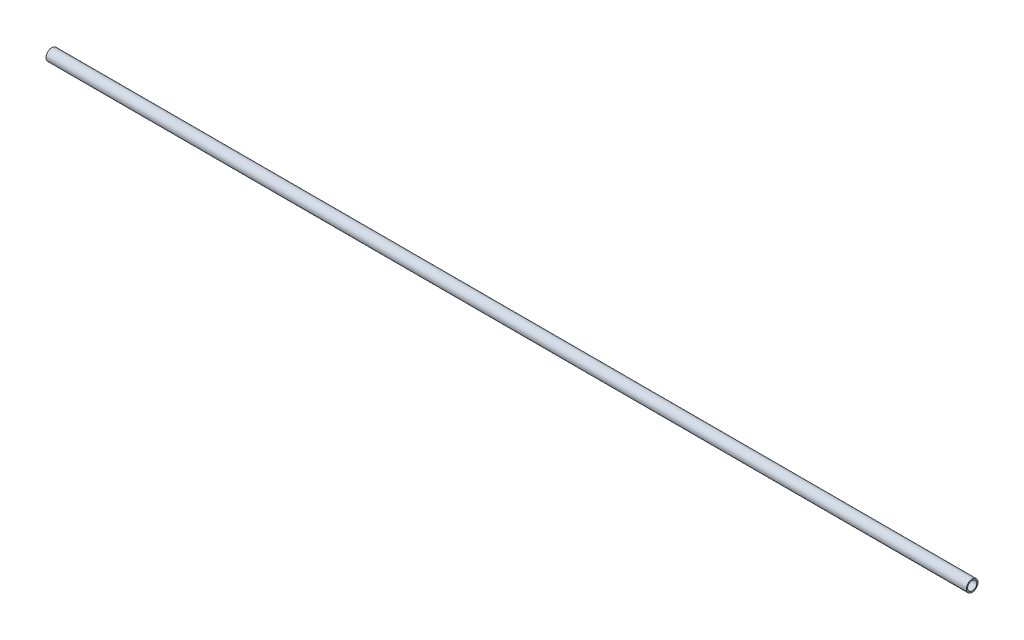
ISO-10303-21;
HEADER;
FILE_DESCRIPTION(('STEP AP214'),'2;1');
FILE_NAME('part.step','',(''),(''),'','','');
FILE_SCHEMA(('AUTOMOTIVE_DESIGN { 1 0 10303 214 1 1 1 1 }'));
ENDSEC;
DATA;
#1=APPLICATION_CONTEXT('core data for automotive mechanical design processes');
#2=APPLICATION_PROTOCOL_DEFINITION('international standard','automotive_design',2000,#1);
#3=PRODUCT_CONTEXT('',#1,'mechanical');
#4=PRODUCT('Part','Part','',(#3));
#5=PRODUCT_RELATED_PRODUCT_CATEGORY('part','',(#4));
#6=PRODUCT_DEFINITION_FORMATION('','',#4);
#7=PRODUCT_DEFINITION_CONTEXT('part definition',#1,'design');
#8=PRODUCT_DEFINITION('design','',#6,#7);
#9=PRODUCT_DEFINITION_SHAPE('','',#8);
#10=(LENGTH_UNIT() NAMED_UNIT(*) SI_UNIT(.MILLI.,.METRE.));
#11=(NAMED_UNIT(*) PLANE_ANGLE_UNIT() SI_UNIT($,.RADIAN.));
#12=(NAMED_UNIT(*) SI_UNIT($,.STERADIAN.) SOLID_ANGLE_UNIT());
#13=UNCERTAINTY_MEASURE_WITH_UNIT(LENGTH_MEASURE(1.E-05),#10,'distance_accuracy_value','');
#14=(GEOMETRIC_REPRESENTATION_CONTEXT(3) GLOBAL_UNCERTAINTY_ASSIGNED_CONTEXT((#13)) GLOBAL_UNIT_ASSIGNED_CONTEXT((#10,
#11,#12)) REPRESENTATION_CONTEXT('',''));
#15=CARTESIAN_POINT('',(0.,0.,0.));
#16=DIRECTION('',(0.,0.,1.));
#17=DIRECTION('',(1.,0.,0.));
#18=AXIS2_PLACEMENT_3D('',#15,#16,#17);
#19=CARTESIAN_POINT('',(3000.,0.,0.));
#20=DIRECTION('',(1.,0.,0.));
#21=DIRECTION('',(0.,0.,-1.));
#22=AXIS2_PLACEMENT_3D('',#19,#20,#21);
#23=PLANE('',#22);
#24=CARTESIAN_POINT('',(3000.,0.,0.));
#25=DIRECTION('',(1.,0.,0.));
#26=DIRECTION('',(0.,0.,-1.));
#27=AXIS2_PLACEMENT_3D('',#24,#25,#26);
#28=CIRCLE('',#27,19.);
#29=CARTESIAN_POINT('',(3000.,0.,-19.));
#30=VERTEX_POINT('',#29);
#31=EDGE_CURVE('E10',#30,#30,#28,.T.);
#32=ORIENTED_EDGE('',*,*,#31,.T.);
#33=EDGE_LOOP('',(#32));
#34=FACE_BOUND('',#33,.T.);
#35=CARTESIAN_POINT('',(3000.,0.,0.));
#36=DIRECTION('',(1.,0.,0.));
#37=DIRECTION('',(0.,0.,-1.));
#38=AXIS2_PLACEMENT_3D('',#35,#36,#37);
#39=CIRCLE('',#38,15.);
#40=CARTESIAN_POINT('',(3000.,0.,-15.));
#41=VERTEX_POINT('',#40);
#42=EDGE_CURVE('E41',#41,#41,#39,.T.);
#43=ORIENTED_EDGE('',*,*,#42,.F.);
#44=EDGE_LOOP('',(#43));
#45=FACE_BOUND('',#44,.T.);
#46=ADVANCED_FACE('F30',(#34,#45),#23,.T.);
#47=CARTESIAN_POINT('',(0.,0.,0.));
#48=DIRECTION('',(1.,0.,0.));
#49=DIRECTION('',(0.,0.,-1.));
#50=AXIS2_PLACEMENT_3D('',#47,#48,#49);
#51=PLANE('',#50);
#52=CARTESIAN_POINT('',(0.,0.,0.));
#53=DIRECTION('',(1.,0.,0.));
#54=DIRECTION('',(0.,0.,-1.));
#55=AXIS2_PLACEMENT_3D('',#52,#53,#54);
#56=CIRCLE('',#55,19.);
#57=CARTESIAN_POINT('',(0.,0.,-19.));
#58=VERTEX_POINT('',#57);
#59=EDGE_CURVE('E34',#58,#58,#56,.T.);
#60=ORIENTED_EDGE('',*,*,#59,.F.);
#61=EDGE_LOOP('',(#60));
#62=FACE_BOUND('',#61,.T.);
#63=CARTESIAN_POINT('',(0.,0.,0.));
#64=DIRECTION('',(1.,0.,0.));
#65=DIRECTION('',(0.,0.,-1.));
#66=AXIS2_PLACEMENT_3D('',#63,#64,#65);
#67=CIRCLE('',#66,15.);
#68=CARTESIAN_POINT('',(0.,0.,-15.));
#69=VERTEX_POINT('',#68);
#70=EDGE_CURVE('E43',#69,#69,#67,.T.);
#71=ORIENTED_EDGE('',*,*,#70,.T.);
#72=EDGE_LOOP('',(#71));
#73=FACE_BOUND('',#72,.T.);
#74=ADVANCED_FACE('F53',(#62,#73),#51,.F.);
#75=CARTESIAN_POINT('',(3000.,0.,0.));
#76=DIRECTION('',(-1.,0.,0.));
#77=DIRECTION('',(0.,0.,1.));
#78=AXIS2_PLACEMENT_3D('',#75,#76,#77);
#79=CYLINDRICAL_SURFACE('',#78,19.);
#80=ORIENTED_EDGE('',*,*,#31,.F.);
#81=EDGE_LOOP('',(#80));
#82=FACE_BOUND('',#81,.T.);
#83=ORIENTED_EDGE('',*,*,#59,.T.);
#84=EDGE_LOOP('',(#83));
#85=FACE_BOUND('',#84,.T.);
#86=ADVANCED_FACE('F32',(#82,#85),#79,.T.);
#87=CARTESIAN_POINT('',(3000.,0.,0.));
#88=DIRECTION('',(-1.,0.,0.));
#89=DIRECTION('',(0.,0.,1.));
#90=AXIS2_PLACEMENT_3D('',#87,#88,#89);
#91=CYLINDRICAL_SURFACE('',#90,15.);
#92=ORIENTED_EDGE('',*,*,#42,.T.);
#93=EDGE_LOOP('',(#92));
#94=FACE_BOUND('',#93,.T.);
#95=ORIENTED_EDGE('',*,*,#70,.F.);
#96=EDGE_LOOP('',(#95));
#97=FACE_BOUND('',#96,.T.);
#98=ADVANCED_FACE('F49',(#94,#97),#91,.F.);
#99=CLOSED_SHELL('',(#46,#74,#86,#98));
#100=MANIFOLD_SOLID_BREP('B2',#99);
#101=ADVANCED_BREP_SHAPE_REPRESENTATION('',(#18,#100),#14);
#102=SHAPE_DEFINITION_REPRESENTATION(#9,#101);
ENDSEC;
END-ISO-10303-21;
